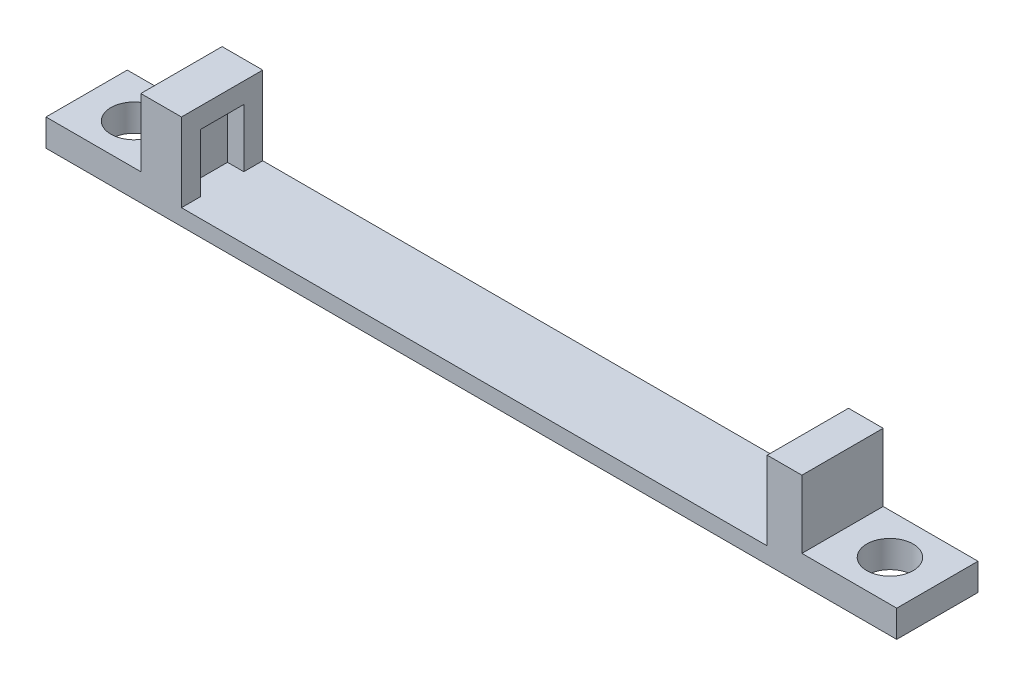
ISO-10303-21;
HEADER;
FILE_DESCRIPTION(('STEP AP214'),'2;1');
FILE_NAME('part.step','',(''),(''),'','','');
FILE_SCHEMA(('AUTOMOTIVE_DESIGN { 1 0 10303 214 1 1 1 1 }'));
ENDSEC;
DATA;
#1=APPLICATION_CONTEXT('core data for automotive mechanical design processes');
#2=APPLICATION_PROTOCOL_DEFINITION('international standard','automotive_design',2000,#1);
#3=PRODUCT_CONTEXT('',#1,'mechanical');
#4=PRODUCT('Part','Part','',(#3));
#5=PRODUCT_RELATED_PRODUCT_CATEGORY('part','',(#4));
#6=PRODUCT_DEFINITION_FORMATION('','',#4);
#7=PRODUCT_DEFINITION_CONTEXT('part definition',#1,'design');
#8=PRODUCT_DEFINITION('design','',#6,#7);
#9=PRODUCT_DEFINITION_SHAPE('','',#8);
#10=(LENGTH_UNIT() NAMED_UNIT(*) SI_UNIT(.MILLI.,.METRE.));
#11=(NAMED_UNIT(*) PLANE_ANGLE_UNIT() SI_UNIT($,.RADIAN.));
#12=(NAMED_UNIT(*) SI_UNIT($,.STERADIAN.) SOLID_ANGLE_UNIT());
#13=UNCERTAINTY_MEASURE_WITH_UNIT(LENGTH_MEASURE(1.E-05),#10,'distance_accuracy_value','');
#14=(GEOMETRIC_REPRESENTATION_CONTEXT(3) GLOBAL_UNCERTAINTY_ASSIGNED_CONTEXT((#13)) GLOBAL_UNIT_ASSIGNED_CONTEXT((#10,
#11,#12)) REPRESENTATION_CONTEXT('',''));
#15=CARTESIAN_POINT('',(0.,0.,0.));
#16=DIRECTION('',(0.,0.,1.));
#17=DIRECTION('',(1.,0.,0.));
#18=AXIS2_PLACEMENT_3D('',#15,#16,#17);
#19=CARTESIAN_POINT('',(53.6739636473072,1.524,5.87264658762612));
#20=DIRECTION('',(1.,0.,0.));
#21=DIRECTION('',(0.,0.,-1.));
#22=AXIS2_PLACEMENT_3D('',#19,#20,#21);
#23=PLANE('',#22);
#24=DIRECTION('',(0.,0.,-1.));
#25=VECTOR('',#24,1.);
#26=CARTESIAN_POINT('',(53.6739636473072,8.89,5.87264658762612));
#27=LINE('',#26,#25);
#28=CARTESIAN_POINT('',(53.6739636473072,8.89,13.4926465876261));
#29=VERTEX_POINT('',#28);
#30=CARTESIAN_POINT('',(53.6739636473072,8.89,5.87264658762612));
#31=VERTEX_POINT('',#30);
#32=EDGE_CURVE('E240',#29,#31,#27,.T.);
#33=ORIENTED_EDGE('',*,*,#32,.T.);
#34=DIRECTION('',(0.,1.,0.));
#35=VECTOR('',#34,1.);
#36=CARTESIAN_POINT('',(53.6739636473072,1.524,5.87264658762612));
#37=LINE('',#36,#35);
#38=CARTESIAN_POINT('',(53.6739636473072,1.524,5.87264658762612));
#39=VERTEX_POINT('',#38);
#40=EDGE_CURVE('E245',#39,#31,#37,.T.);
#41=ORIENTED_EDGE('',*,*,#40,.F.);
#42=DIRECTION('',(0.,0.,-1.));
#43=VECTOR('',#42,1.);
#44=CARTESIAN_POINT('',(53.6739636473072,1.524,5.87264658762612));
#45=LINE('',#44,#43);
#46=CARTESIAN_POINT('',(53.6739636473072,1.524,13.4926465876261));
#47=VERTEX_POINT('',#46);
#48=EDGE_CURVE('E232',#47,#39,#45,.T.);
#49=ORIENTED_EDGE('',*,*,#48,.F.);
#50=DIRECTION('',(0.,1.,0.));
#51=VECTOR('',#50,1.);
#52=CARTESIAN_POINT('',(53.6739636473072,1.524,13.4926465876261));
#53=LINE('',#52,#51);
#54=EDGE_CURVE('E248',#47,#29,#53,.T.);
#55=ORIENTED_EDGE('',*,*,#54,.T.);
#56=EDGE_LOOP('',(#33,#41,#49,#55));
#57=FACE_BOUND('',#56,.T.);
#58=DIRECTION('',(0.,-1.,0.));
#59=VECTOR('',#58,1.);
#60=CARTESIAN_POINT('',(53.6739636473072,6.985,7.84114658762612));
#61=LINE('',#60,#59);
#62=CARTESIAN_POINT('',(53.6739636473072,6.985,7.84114658762612));
#63=VERTEX_POINT('',#62);
#64=CARTESIAN_POINT('',(53.6739636473072,2.54,7.84114658762612));
#65=VERTEX_POINT('',#64);
#66=EDGE_CURVE('E189',#63,#65,#61,.T.);
#67=ORIENTED_EDGE('',*,*,#66,.F.);
#68=DIRECTION('',(0.,0.,-1.));
#69=VECTOR('',#68,1.);
#70=CARTESIAN_POINT('',(53.6739636473072,6.985,7.84114658762612));
#71=LINE('',#70,#69);
#72=CARTESIAN_POINT('',(53.6739636473072,6.985,11.5241465876261));
#73=VERTEX_POINT('',#72);
#74=EDGE_CURVE('E186',#73,#63,#71,.T.);
#75=ORIENTED_EDGE('',*,*,#74,.F.);
#76=DIRECTION('',(0.,1.,0.));
#77=VECTOR('',#76,1.);
#78=CARTESIAN_POINT('',(53.6739636473072,6.985,11.5241465876261));
#79=LINE('',#78,#77);
#80=CARTESIAN_POINT('',(53.6739636473072,2.54,11.5241465876261));
#81=VERTEX_POINT('',#80);
#82=EDGE_CURVE('E53',#81,#73,#79,.T.);
#83=ORIENTED_EDGE('',*,*,#82,.F.);
#84=DIRECTION('',(0.,0.,1.));
#85=VECTOR('',#84,1.);
#86=CARTESIAN_POINT('',(53.6739636473072,2.54,7.84114658762612));
#87=LINE('',#86,#85);
#88=EDGE_CURVE('E48',#65,#81,#87,.T.);
#89=ORIENTED_EDGE('',*,*,#88,.F.);
#90=EDGE_LOOP('',(#67,#75,#83,#89));
#91=FACE_BOUND('',#90,.T.);
#92=ADVANCED_FACE('F33',(#57,#91),#23,.F.);
#93=CARTESIAN_POINT('',(0.,8.89,0.));
#94=DIRECTION('',(0.,1.,0.));
#95=DIRECTION('',(0.,0.,1.));
#96=AXIS2_PLACEMENT_3D('',#93,#94,#95);
#97=PLANE('',#96);
#98=DIRECTION('',(0.,0.,1.));
#99=VECTOR('',#98,1.);
#100=CARTESIAN_POINT('',(-1.24083635269281,8.89,5.87264658762612));
#101=LINE('',#100,#99);
#102=CARTESIAN_POINT('',(-1.24083635269281,8.89,5.87264658762612));
#103=VERTEX_POINT('',#102);
#104=CARTESIAN_POINT('',(-1.2408363526928,8.89,13.4926465876261));
#105=VERTEX_POINT('',#104);
#106=EDGE_CURVE('E218',#103,#105,#101,.T.);
#107=ORIENTED_EDGE('',*,*,#106,.F.);
#108=DIRECTION('',(-1.,0.,0.));
#109=VECTOR('',#108,1.);
#110=CARTESIAN_POINT('',(-13.9408363526928,8.89,5.87264658762612));
#111=LINE('',#110,#109);
#112=CARTESIAN_POINT('',(-5.05083635269281,8.89,5.87264658762612));
#113=VERTEX_POINT('',#112);
#114=EDGE_CURVE('E291',#103,#113,#111,.T.);
#115=ORIENTED_EDGE('',*,*,#114,.T.);
#116=DIRECTION('',(0.,0.,-1.));
#117=VECTOR('',#116,1.);
#118=CARTESIAN_POINT('',(-5.05083635269281,8.89,5.87264658762612));
#119=LINE('',#118,#117);
#120=CARTESIAN_POINT('',(-5.05083635269281,8.89,13.4926465876261));
#121=VERTEX_POINT('',#120);
#122=EDGE_CURVE('E268',#121,#113,#119,.T.);
#123=ORIENTED_EDGE('',*,*,#122,.F.);
#124=DIRECTION('',(1.,0.,0.));
#125=VECTOR('',#124,1.);
#126=CARTESIAN_POINT('',(-13.9408363526928,8.89,13.4926465876261));
#127=LINE('',#126,#125);
#128=EDGE_CURVE('E288',#121,#105,#127,.T.);
#129=ORIENTED_EDGE('',*,*,#128,.T.);
#130=EDGE_LOOP('',(#107,#115,#123,#129));
#131=FACE_BOUND('',#130,.T.);
#132=ADVANCED_FACE('F358',(#131),#97,.T.);
#133=CARTESIAN_POINT('',(-13.9408363526928,8.89,5.87264658762612));
#134=DIRECTION('',(1.,0.,0.));
#135=DIRECTION('',(0.,0.,-1.));
#136=AXIS2_PLACEMENT_3D('',#133,#134,#135);
#137=PLANE('',#136);
#138=DIRECTION('',(0.,0.,1.));
#139=VECTOR('',#138,1.);
#140=CARTESIAN_POINT('',(-13.9408363526928,2.54,5.87264658762612));
#141=LINE('',#140,#139);
#142=CARTESIAN_POINT('',(-13.9408363526928,2.54,5.87264658762612));
#143=VERTEX_POINT('',#142);
#144=CARTESIAN_POINT('',(-13.9408363526928,2.54,13.4926465876261));
#145=VERTEX_POINT('',#144);
#146=EDGE_CURVE('E270',#143,#145,#141,.T.);
#147=ORIENTED_EDGE('',*,*,#146,.F.);
#148=DIRECTION('',(0.,-1.,0.));
#149=VECTOR('',#148,1.);
#150=CARTESIAN_POINT('',(-13.9408363526928,8.89,5.87264658762612));
#151=LINE('',#150,#149);
#152=CARTESIAN_POINT('',(-13.9408363526928,0.,5.87264658762612));
#153=VERTEX_POINT('',#152);
#154=EDGE_CURVE('E296',#143,#153,#151,.T.);
#155=ORIENTED_EDGE('',*,*,#154,.T.);
#156=DIRECTION('',(0.,0.,1.));
#157=VECTOR('',#156,1.);
#158=CARTESIAN_POINT('',(-13.9408363526928,0.,5.87264658762612));
#159=LINE('',#158,#157);
#160=CARTESIAN_POINT('',(-13.9408363526928,0.,13.4926465876261));
#161=VERTEX_POINT('',#160);
#162=EDGE_CURVE('E286',#153,#161,#159,.T.);
#163=ORIENTED_EDGE('',*,*,#162,.T.);
#164=DIRECTION('',(0.,-1.,0.));
#165=VECTOR('',#164,1.);
#166=CARTESIAN_POINT('',(-13.9408363526928,8.89,13.4926465876261));
#167=LINE('',#166,#165);
#168=EDGE_CURVE('E11',#145,#161,#167,.T.);
#169=ORIENTED_EDGE('',*,*,#168,.F.);
#170=EDGE_LOOP('',(#147,#155,#163,#169));
#171=FACE_BOUND('',#170,.T.);
#172=ADVANCED_FACE('F35',(#171),#137,.F.);
#173=CARTESIAN_POINT('',(-13.9408363526928,8.89,13.4926465876261));
#174=DIRECTION('',(0.,0.,-1.));
#175=DIRECTION('',(-1.,0.,0.));
#176=AXIS2_PLACEMENT_3D('',#173,#174,#175);
#177=PLANE('',#176);
#178=DIRECTION('',(1.,0.,0.));
#179=VECTOR('',#178,1.);
#180=CARTESIAN_POINT('',(-1.2408363526928,1.524,13.4926465876261));
#181=LINE('',#180,#179);
#182=CARTESIAN_POINT('',(-1.2408363526928,1.524,13.4926465876261));
#183=VERTEX_POINT('',#182);
#184=EDGE_CURVE('E228',#183,#47,#181,.T.);
#185=ORIENTED_EDGE('',*,*,#184,.F.);
#186=DIRECTION('',(0.,1.,0.));
#187=VECTOR('',#186,1.);
#188=CARTESIAN_POINT('',(-1.2408363526928,1.524,13.4926465876261));
#189=LINE('',#188,#187);
#190=EDGE_CURVE('E238',#183,#105,#189,.T.);
#191=ORIENTED_EDGE('',*,*,#190,.T.);
#192=ORIENTED_EDGE('',*,*,#128,.F.);
#193=DIRECTION('',(0.,1.,0.));
#194=VECTOR('',#193,1.);
#195=CARTESIAN_POINT('',(-5.05083635269281,2.54,13.4926465876261));
#196=LINE('',#195,#194);
#197=CARTESIAN_POINT('',(-5.05083635269281,2.54,13.4926465876261));
#198=VERTEX_POINT('',#197);
#199=EDGE_CURVE('E280',#198,#121,#196,.T.);
#200=ORIENTED_EDGE('',*,*,#199,.F.);
#201=DIRECTION('',(1.,0.,0.));
#202=VECTOR('',#201,1.);
#203=CARTESIAN_POINT('',(-13.9408363526928,2.54,13.4926465876261));
#204=LINE('',#203,#202);
#205=EDGE_CURVE('E272',#145,#198,#204,.T.);
#206=ORIENTED_EDGE('',*,*,#205,.F.);
#207=ORIENTED_EDGE('',*,*,#168,.T.);
#208=DIRECTION('',(1.,0.,0.));
#209=VECTOR('',#208,1.);
#210=CARTESIAN_POINT('',(-13.9408363526928,0.,13.4926465876261));
#211=LINE('',#210,#209);
#212=CARTESIAN_POINT('',(65.8151636473072,0.,13.4926465876261));
#213=VERTEX_POINT('',#212);
#214=EDGE_CURVE('E299',#161,#213,#211,.T.);
#215=ORIENTED_EDGE('',*,*,#214,.T.);
#216=DIRECTION('',(0.,-1.,0.));
#217=VECTOR('',#216,1.);
#218=CARTESIAN_POINT('',(65.8151636473072,8.89,13.4926465876261));
#219=LINE('',#218,#217);
#220=CARTESIAN_POINT('',(65.8151636473072,2.54,13.4926465876261));
#221=VERTEX_POINT('',#220);
#222=EDGE_CURVE('E41',#221,#213,#219,.T.);
#223=ORIENTED_EDGE('',*,*,#222,.F.);
#224=DIRECTION('',(1.,0.,0.));
#225=VECTOR('',#224,1.);
#226=CARTESIAN_POINT('',(65.8151636473072,2.54,13.4926465876261));
#227=LINE('',#226,#225);
#228=CARTESIAN_POINT('',(56.9251636473072,2.54,13.4926465876261));
#229=VERTEX_POINT('',#228);
#230=EDGE_CURVE('E260',#229,#221,#227,.T.);
#231=ORIENTED_EDGE('',*,*,#230,.F.);
#232=DIRECTION('',(0.,1.,0.));
#233=VECTOR('',#232,1.);
#234=CARTESIAN_POINT('',(56.9251636473072,2.54,13.4926465876261));
#235=LINE('',#234,#233);
#236=CARTESIAN_POINT('',(56.9251636473072,8.89,13.4926465876261));
#237=VERTEX_POINT('',#236);
#238=EDGE_CURVE('E265',#229,#237,#235,.T.);
#239=ORIENTED_EDGE('',*,*,#238,.T.);
#240=EDGE_CURVE('E292',#29,#237,#127,.T.);
#241=ORIENTED_EDGE('',*,*,#240,.F.);
#242=ORIENTED_EDGE('',*,*,#54,.F.);
#243=EDGE_LOOP('',(#185,#191,#192,#200,#206,#207,#215,#223,#231,#239,#241,#242));
#244=FACE_BOUND('',#243,.T.);
#245=ADVANCED_FACE('F321',(#244),#177,.F.);
#246=CARTESIAN_POINT('',(65.8151636473072,8.89,5.87264658762612));
#247=DIRECTION('',(-1.,0.,0.));
#248=DIRECTION('',(0.,0.,1.));
#249=AXIS2_PLACEMENT_3D('',#246,#247,#248);
#250=PLANE('',#249);
#251=DIRECTION('',(0.,-1.,0.));
#252=VECTOR('',#251,1.);
#253=CARTESIAN_POINT('',(65.8151636473072,8.89,5.87264658762612));
#254=LINE('',#253,#252);
#255=CARTESIAN_POINT('',(65.8151636473072,2.54,5.87264658762612));
#256=VERTEX_POINT('',#255);
#257=CARTESIAN_POINT('',(65.8151636473072,0.,5.87264658762612));
#258=VERTEX_POINT('',#257);
#259=EDGE_CURVE('E309',#256,#258,#254,.T.);
#260=ORIENTED_EDGE('',*,*,#259,.F.);
#261=DIRECTION('',(0.,0.,-1.));
#262=VECTOR('',#261,1.);
#263=CARTESIAN_POINT('',(65.8151636473072,2.54,5.87264658762612));
#264=LINE('',#263,#262);
#265=EDGE_CURVE('E252',#221,#256,#264,.T.);
#266=ORIENTED_EDGE('',*,*,#265,.F.);
#267=ORIENTED_EDGE('',*,*,#222,.T.);
#268=DIRECTION('',(0.,0.,-1.));
#269=VECTOR('',#268,1.);
#270=CARTESIAN_POINT('',(65.8151636473072,0.,5.87264658762612));
#271=LINE('',#270,#269);
#272=EDGE_CURVE('E302',#213,#258,#271,.T.);
#273=ORIENTED_EDGE('',*,*,#272,.T.);
#274=EDGE_LOOP('',(#260,#266,#267,#273));
#275=FACE_BOUND('',#274,.T.);
#276=ADVANCED_FACE('F314',(#275),#250,.F.);
#277=CARTESIAN_POINT('',(-13.9408363526928,8.89,5.87264658762612));
#278=DIRECTION('',(0.,0.,1.));
#279=DIRECTION('',(1.,0.,0.));
#280=AXIS2_PLACEMENT_3D('',#277,#278,#279);
#281=PLANE('',#280);
#282=ORIENTED_EDGE('',*,*,#114,.F.);
#283=DIRECTION('',(0.,1.,0.));
#284=VECTOR('',#283,1.);
#285=CARTESIAN_POINT('',(-1.24083635269281,1.524,5.87264658762612));
#286=LINE('',#285,#284);
#287=CARTESIAN_POINT('',(-1.24083635269281,1.524,5.87264658762612));
#288=VERTEX_POINT('',#287);
#289=EDGE_CURVE('E242',#288,#103,#286,.T.);
#290=ORIENTED_EDGE('',*,*,#289,.F.);
#291=DIRECTION('',(-1.,0.,0.));
#292=VECTOR('',#291,1.);
#293=CARTESIAN_POINT('',(-1.24083635269281,1.524,5.87264658762612));
#294=LINE('',#293,#292);
#295=EDGE_CURVE('E235',#39,#288,#294,.T.);
#296=ORIENTED_EDGE('',*,*,#295,.F.);
#297=ORIENTED_EDGE('',*,*,#40,.T.);
#298=CARTESIAN_POINT('',(56.9251636473072,8.89,5.87264658762612));
#299=VERTEX_POINT('',#298);
#300=EDGE_CURVE('E293',#299,#31,#111,.T.);
#301=ORIENTED_EDGE('',*,*,#300,.F.);
#302=DIRECTION('',(0.,1.,0.));
#303=VECTOR('',#302,1.);
#304=CARTESIAN_POINT('',(56.9251636473072,2.54,5.87264658762612));
#305=LINE('',#304,#303);
#306=CARTESIAN_POINT('',(56.9251636473072,2.54,5.87264658762612));
#307=VERTEX_POINT('',#306);
#308=EDGE_CURVE('E262',#307,#299,#305,.T.);
#309=ORIENTED_EDGE('',*,*,#308,.F.);
#310=DIRECTION('',(-1.,0.,0.));
#311=VECTOR('',#310,1.);
#312=CARTESIAN_POINT('',(65.8151636473072,2.54,5.87264658762612));
#313=LINE('',#312,#311);
#314=EDGE_CURVE('E254',#256,#307,#313,.T.);
#315=ORIENTED_EDGE('',*,*,#314,.F.);
#316=ORIENTED_EDGE('',*,*,#259,.T.);
#317=DIRECTION('',(-1.,0.,0.));
#318=VECTOR('',#317,1.);
#319=CARTESIAN_POINT('',(-13.9408363526928,0.,5.87264658762612));
#320=LINE('',#319,#318);
#321=EDGE_CURVE('E305',#258,#153,#320,.T.);
#322=ORIENTED_EDGE('',*,*,#321,.T.);
#323=ORIENTED_EDGE('',*,*,#154,.F.);
#324=DIRECTION('',(-1.,0.,0.));
#325=VECTOR('',#324,1.);
#326=CARTESIAN_POINT('',(-13.9408363526928,2.54,5.87264658762612));
#327=LINE('',#326,#325);
#328=CARTESIAN_POINT('',(-5.05083635269281,2.54,5.87264658762612));
#329=VERTEX_POINT('',#328);
#330=EDGE_CURVE('E278',#329,#143,#327,.T.);
#331=ORIENTED_EDGE('',*,*,#330,.F.);
#332=DIRECTION('',(0.,1.,0.));
#333=VECTOR('',#332,1.);
#334=CARTESIAN_POINT('',(-5.05083635269281,2.54,5.87264658762612));
#335=LINE('',#334,#333);
#336=EDGE_CURVE('E283',#329,#113,#335,.T.);
#337=ORIENTED_EDGE('',*,*,#336,.T.);
#338=EDGE_LOOP('',(#282,#290,#296,#297,#301,#309,#315,#316,#322,#323,#331,#337));
#339=FACE_BOUND('',#338,.T.);
#340=ADVANCED_FACE('F330',(#339),#281,.F.);
#341=ORIENTED_EDGE('',*,*,#32,.F.);
#342=ORIENTED_EDGE('',*,*,#240,.T.);
#343=DIRECTION('',(0.,0.,1.));
#344=VECTOR('',#343,1.);
#345=CARTESIAN_POINT('',(56.9251636473072,8.89,5.87264658762612));
#346=LINE('',#345,#344);
#347=EDGE_CURVE('E244',#299,#237,#346,.T.);
#348=ORIENTED_EDGE('',*,*,#347,.F.);
#349=ORIENTED_EDGE('',*,*,#300,.T.);
#350=EDGE_LOOP('',(#341,#342,#348,#349));
#351=FACE_BOUND('',#350,.T.);
#352=ADVANCED_FACE('F344',(#351),#97,.T.);
#353=CARTESIAN_POINT('',(0.,0.,0.));
#354=DIRECTION('',(0.,1.,0.));
#355=DIRECTION('',(0.,0.,1.));
#356=AXIS2_PLACEMENT_3D('',#353,#354,#355);
#357=PLANE('',#356);
#358=CARTESIAN_POINT('',(61.3701636473072,0.,9.68264658762611));
#359=DIRECTION('',(0.,1.,0.));
#360=DIRECTION('',(0.,0.,1.));
#361=AXIS2_PLACEMENT_3D('',#358,#359,#360);
#362=CIRCLE('',#361,2.17169999999999);
#363=CARTESIAN_POINT('',(61.3701636473072,0.,11.8543465876261));
#364=VERTEX_POINT('',#363);
#365=EDGE_CURVE('E588',#364,#364,#362,.T.);
#366=ORIENTED_EDGE('',*,*,#365,.T.);
#367=EDGE_LOOP('',(#366));
#368=FACE_BOUND('',#367,.T.);
#369=CARTESIAN_POINT('',(-9.49583635269281,0.,9.68264658762611));
#370=DIRECTION('',(0.,1.,0.));
#371=DIRECTION('',(0.,0.,1.));
#372=AXIS2_PLACEMENT_3D('',#369,#370,#371);
#373=CIRCLE('',#372,2.1717);
#374=CARTESIAN_POINT('',(-9.49583635269281,0.,11.8543465876261));
#375=VERTEX_POINT('',#374);
#376=EDGE_CURVE('E596',#375,#375,#373,.T.);
#377=ORIENTED_EDGE('',*,*,#376,.T.);
#378=EDGE_LOOP('',(#377));
#379=FACE_BOUND('',#378,.T.);
#380=ORIENTED_EDGE('',*,*,#162,.F.);
#381=ORIENTED_EDGE('',*,*,#321,.F.);
#382=ORIENTED_EDGE('',*,*,#272,.F.);
#383=ORIENTED_EDGE('',*,*,#214,.F.);
#384=EDGE_LOOP('',(#380,#381,#382,#383));
#385=FACE_BOUND('',#384,.T.);
#386=ADVANCED_FACE('F326',(#368,#379,#385),#357,.F.);
#387=CARTESIAN_POINT('',(-5.05083635269281,2.54,5.87264658762612));
#388=DIRECTION('',(1.,0.,0.));
#389=DIRECTION('',(0.,0.,-1.));
#390=AXIS2_PLACEMENT_3D('',#387,#388,#389);
#391=PLANE('',#390);
#392=ORIENTED_EDGE('',*,*,#122,.T.);
#393=ORIENTED_EDGE('',*,*,#336,.F.);
#394=DIRECTION('',(0.,0.,-1.));
#395=VECTOR('',#394,1.);
#396=CARTESIAN_POINT('',(-5.05083635269281,2.54,5.87264658762612));
#397=LINE('',#396,#395);
#398=EDGE_CURVE('E275',#198,#329,#397,.T.);
#399=ORIENTED_EDGE('',*,*,#398,.F.);
#400=ORIENTED_EDGE('',*,*,#199,.T.);
#401=EDGE_LOOP('',(#392,#393,#399,#400));
#402=FACE_BOUND('',#401,.T.);
#403=ADVANCED_FACE('F360',(#402),#391,.F.);
#404=CARTESIAN_POINT('',(0.,2.54,0.));
#405=DIRECTION('',(0.,1.,0.));
#406=DIRECTION('',(0.,0.,1.));
#407=AXIS2_PLACEMENT_3D('',#404,#405,#406);
#408=PLANE('',#407);
#409=CARTESIAN_POINT('',(-9.49583635269281,2.54,9.68264658762611));
#410=DIRECTION('',(0.,1.,0.));
#411=DIRECTION('',(0.,0.,1.));
#412=AXIS2_PLACEMENT_3D('',#409,#410,#411);
#413=CIRCLE('',#412,2.1717);
#414=CARTESIAN_POINT('',(-9.49583635269281,2.54,11.8543465876261));
#415=VERTEX_POINT('',#414);
#416=EDGE_CURVE('E593',#415,#415,#413,.T.);
#417=ORIENTED_EDGE('',*,*,#416,.F.);
#418=EDGE_LOOP('',(#417));
#419=FACE_BOUND('',#418,.T.);
#420=ORIENTED_EDGE('',*,*,#146,.T.);
#421=ORIENTED_EDGE('',*,*,#205,.T.);
#422=ORIENTED_EDGE('',*,*,#398,.T.);
#423=ORIENTED_EDGE('',*,*,#330,.T.);
#424=EDGE_LOOP('',(#420,#421,#422,#423));
#425=FACE_BOUND('',#424,.T.);
#426=ADVANCED_FACE('F363',(#419,#425),#408,.T.);
#427=CARTESIAN_POINT('',(56.9251636473072,2.54,5.87264658762612));
#428=DIRECTION('',(-1.,0.,0.));
#429=DIRECTION('',(0.,0.,1.));
#430=AXIS2_PLACEMENT_3D('',#427,#428,#429);
#431=PLANE('',#430);
#432=ORIENTED_EDGE('',*,*,#347,.T.);
#433=ORIENTED_EDGE('',*,*,#238,.F.);
#434=DIRECTION('',(0.,0.,1.));
#435=VECTOR('',#434,1.);
#436=CARTESIAN_POINT('',(56.9251636473072,2.54,5.87264658762612));
#437=LINE('',#436,#435);
#438=EDGE_CURVE('E257',#307,#229,#437,.T.);
#439=ORIENTED_EDGE('',*,*,#438,.F.);
#440=ORIENTED_EDGE('',*,*,#308,.T.);
#441=EDGE_LOOP('',(#432,#433,#439,#440));
#442=FACE_BOUND('',#441,.T.);
#443=ADVANCED_FACE('F340',(#442),#431,.F.);
#444=CARTESIAN_POINT('',(0.,2.54,0.));
#445=DIRECTION('',(0.,-1.,0.));
#446=DIRECTION('',(0.,0.,-1.));
#447=AXIS2_PLACEMENT_3D('',#444,#445,#446);
#448=PLANE('',#447);
#449=CARTESIAN_POINT('',(61.3701636473072,2.54,9.68264658762611));
#450=DIRECTION('',(0.,1.,0.));
#451=DIRECTION('',(0.,0.,1.));
#452=AXIS2_PLACEMENT_3D('',#449,#450,#451);
#453=CIRCLE('',#452,2.17169999999999);
#454=CARTESIAN_POINT('',(61.3701636473072,2.54,11.8543465876261));
#455=VERTEX_POINT('',#454);
#456=EDGE_CURVE('E591',#455,#455,#453,.T.);
#457=ORIENTED_EDGE('',*,*,#456,.F.);
#458=EDGE_LOOP('',(#457));
#459=FACE_BOUND('',#458,.T.);
#460=ORIENTED_EDGE('',*,*,#265,.T.);
#461=ORIENTED_EDGE('',*,*,#314,.T.);
#462=ORIENTED_EDGE('',*,*,#438,.T.);
#463=ORIENTED_EDGE('',*,*,#230,.T.);
#464=EDGE_LOOP('',(#460,#461,#462,#463));
#465=FACE_BOUND('',#464,.T.);
#466=ADVANCED_FACE('F336',(#459,#465),#448,.F.);
#467=CARTESIAN_POINT('',(-1.24083635269281,1.524,5.87264658762612));
#468=DIRECTION('',(-1.,0.,0.));
#469=DIRECTION('',(0.,0.,1.));
#470=AXIS2_PLACEMENT_3D('',#467,#468,#469);
#471=PLANE('',#470);
#472=DIRECTION('',(0.,0.,1.));
#473=VECTOR('',#472,1.);
#474=CARTESIAN_POINT('',(-1.24083635269281,1.524,5.87264658762612));
#475=LINE('',#474,#473);
#476=CARTESIAN_POINT('',(-1.24083635269281,1.524,11.7146465876261));
#477=VERTEX_POINT('',#476);
#478=EDGE_CURVE('E229',#477,#183,#475,.T.);
#479=ORIENTED_EDGE('',*,*,#478,.F.);
#480=DIRECTION('',(0.,-1.,0.));
#481=VECTOR('',#480,1.);
#482=CARTESIAN_POINT('',(-1.24083635269281,6.985,11.7146465876261));
#483=LINE('',#482,#481);
#484=CARTESIAN_POINT('',(-1.24083635269281,6.985,11.7146465876261));
#485=VERTEX_POINT('',#484);
#486=EDGE_CURVE('E190',#485,#477,#483,.T.);
#487=ORIENTED_EDGE('',*,*,#486,.F.);
#488=DIRECTION('',(0.,0.,1.));
#489=VECTOR('',#488,1.);
#490=CARTESIAN_POINT('',(-1.24083635269281,6.985,11.7146465876261));
#491=LINE('',#490,#489);
#492=CARTESIAN_POINT('',(-1.24083635269281,6.985,7.65064658762611));
#493=VERTEX_POINT('',#492);
#494=EDGE_CURVE('E202',#493,#485,#491,.T.);
#495=ORIENTED_EDGE('',*,*,#494,.F.);
#496=DIRECTION('',(0.,1.,0.));
#497=VECTOR('',#496,1.);
#498=CARTESIAN_POINT('',(-1.24083635269281,6.985,7.65064658762611));
#499=LINE('',#498,#497);
#500=CARTESIAN_POINT('',(-1.24083635269281,1.524,7.65064658762611));
#501=VERTEX_POINT('',#500);
#502=EDGE_CURVE('E192',#501,#493,#499,.T.);
#503=ORIENTED_EDGE('',*,*,#502,.F.);
#504=EDGE_CURVE('E225',#288,#501,#475,.T.);
#505=ORIENTED_EDGE('',*,*,#504,.F.);
#506=ORIENTED_EDGE('',*,*,#289,.T.);
#507=ORIENTED_EDGE('',*,*,#106,.T.);
#508=ORIENTED_EDGE('',*,*,#190,.F.);
#509=EDGE_LOOP('',(#479,#487,#495,#503,#505,#506,#507,#508));
#510=FACE_BOUND('',#509,.T.);
#511=ADVANCED_FACE('F378',(#510),#471,.F.);
#512=CARTESIAN_POINT('',(0.,1.524,0.));
#513=DIRECTION('',(0.,1.,0.));
#514=DIRECTION('',(0.,0.,1.));
#515=AXIS2_PLACEMENT_3D('',#512,#513,#514);
#516=PLANE('',#515);
#517=ORIENTED_EDGE('',*,*,#504,.T.);
#518=DIRECTION('',(1.,0.,0.));
#519=VECTOR('',#518,1.);
#520=CARTESIAN_POINT('',(-2.76483635269281,1.524,7.65064658762611));
#521=LINE('',#520,#519);
#522=CARTESIAN_POINT('',(-2.76483635269281,1.524,7.65064658762611));
#523=VERTEX_POINT('',#522);
#524=EDGE_CURVE('E221',#523,#501,#521,.T.);
#525=ORIENTED_EDGE('',*,*,#524,.F.);
#526=DIRECTION('',(0.,0.,-1.));
#527=VECTOR('',#526,1.);
#528=CARTESIAN_POINT('',(-2.76483635269281,1.524,11.7146465876261));
#529=LINE('',#528,#527);
#530=CARTESIAN_POINT('',(-2.76483635269281,1.524,11.7146465876261));
#531=VERTEX_POINT('',#530);
#532=EDGE_CURVE('E201',#531,#523,#529,.T.);
#533=ORIENTED_EDGE('',*,*,#532,.F.);
#534=DIRECTION('',(1.,0.,0.));
#535=VECTOR('',#534,1.);
#536=CARTESIAN_POINT('',(-2.76483635269281,1.524,11.7146465876261));
#537=LINE('',#536,#535);
#538=EDGE_CURVE('E210',#531,#477,#537,.T.);
#539=ORIENTED_EDGE('',*,*,#538,.T.);
#540=ORIENTED_EDGE('',*,*,#478,.T.);
#541=ORIENTED_EDGE('',*,*,#184,.T.);
#542=ORIENTED_EDGE('',*,*,#48,.T.);
#543=ORIENTED_EDGE('',*,*,#295,.T.);
#544=EDGE_LOOP('',(#517,#525,#533,#539,#540,#541,#542,#543));
#545=FACE_BOUND('',#544,.T.);
#546=ADVANCED_FACE('F349',(#545),#516,.T.);
#547=CARTESIAN_POINT('',(-2.76483635269281,6.985,11.7146465876261));
#548=DIRECTION('',(0.,0.,1.));
#549=DIRECTION('',(1.,0.,0.));
#550=AXIS2_PLACEMENT_3D('',#547,#548,#549);
#551=PLANE('',#550);
#552=ORIENTED_EDGE('',*,*,#486,.T.);
#553=ORIENTED_EDGE('',*,*,#538,.F.);
#554=DIRECTION('',(0.,-1.,0.));
#555=VECTOR('',#554,1.);
#556=CARTESIAN_POINT('',(-2.76483635269281,6.985,11.7146465876261));
#557=LINE('',#556,#555);
#558=CARTESIAN_POINT('',(-2.76483635269281,6.985,11.7146465876261));
#559=VERTEX_POINT('',#558);
#560=EDGE_CURVE('E198',#559,#531,#557,.T.);
#561=ORIENTED_EDGE('',*,*,#560,.F.);
#562=DIRECTION('',(1.,0.,0.));
#563=VECTOR('',#562,1.);
#564=CARTESIAN_POINT('',(-2.76483635269281,6.985,11.7146465876261));
#565=LINE('',#564,#563);
#566=EDGE_CURVE('E216',#559,#485,#565,.T.);
#567=ORIENTED_EDGE('',*,*,#566,.T.);
#568=EDGE_LOOP('',(#552,#553,#561,#567));
#569=FACE_BOUND('',#568,.T.);
#570=ADVANCED_FACE('F444',(#569),#551,.F.);
#571=CARTESIAN_POINT('',(-2.76483635269281,6.985,11.7146465876261));
#572=DIRECTION('',(0.,1.,0.));
#573=DIRECTION('',(0.,0.,1.));
#574=AXIS2_PLACEMENT_3D('',#571,#572,#573);
#575=PLANE('',#574);
#576=ORIENTED_EDGE('',*,*,#494,.T.);
#577=ORIENTED_EDGE('',*,*,#566,.F.);
#578=DIRECTION('',(0.,0.,1.));
#579=VECTOR('',#578,1.);
#580=CARTESIAN_POINT('',(-2.76483635269281,6.985,11.7146465876261));
#581=LINE('',#580,#579);
#582=CARTESIAN_POINT('',(-2.76483635269281,6.985,7.65064658762611));
#583=VERTEX_POINT('',#582);
#584=EDGE_CURVE('E208',#583,#559,#581,.T.);
#585=ORIENTED_EDGE('',*,*,#584,.F.);
#586=DIRECTION('',(1.,0.,0.));
#587=VECTOR('',#586,1.);
#588=CARTESIAN_POINT('',(-2.76483635269281,6.985,7.65064658762611));
#589=LINE('',#588,#587);
#590=EDGE_CURVE('E219',#583,#493,#589,.T.);
#591=ORIENTED_EDGE('',*,*,#590,.T.);
#592=EDGE_LOOP('',(#576,#577,#585,#591));
#593=FACE_BOUND('',#592,.T.);
#594=ADVANCED_FACE('F450',(#593),#575,.F.);
#595=CARTESIAN_POINT('',(-2.76483635269281,6.985,7.65064658762611));
#596=DIRECTION('',(0.,0.,-1.));
#597=DIRECTION('',(-1.,0.,0.));
#598=AXIS2_PLACEMENT_3D('',#595,#596,#597);
#599=PLANE('',#598);
#600=ORIENTED_EDGE('',*,*,#502,.T.);
#601=ORIENTED_EDGE('',*,*,#590,.F.);
#602=DIRECTION('',(0.,1.,0.));
#603=VECTOR('',#602,1.);
#604=CARTESIAN_POINT('',(-2.76483635269281,6.985,7.65064658762611));
#605=LINE('',#604,#603);
#606=EDGE_CURVE('E205',#523,#583,#605,.T.);
#607=ORIENTED_EDGE('',*,*,#606,.F.);
#608=ORIENTED_EDGE('',*,*,#524,.T.);
#609=EDGE_LOOP('',(#600,#601,#607,#608));
#610=FACE_BOUND('',#609,.T.);
#611=ADVANCED_FACE('F457',(#610),#599,.F.);
#612=CARTESIAN_POINT('',(-2.76483635269281,0.,0.));
#613=DIRECTION('',(1.,0.,0.));
#614=DIRECTION('',(0.,0.,-1.));
#615=AXIS2_PLACEMENT_3D('',#612,#613,#614);
#616=PLANE('',#615);
#617=ORIENTED_EDGE('',*,*,#560,.T.);
#618=ORIENTED_EDGE('',*,*,#532,.T.);
#619=ORIENTED_EDGE('',*,*,#606,.T.);
#620=ORIENTED_EDGE('',*,*,#584,.T.);
#621=EDGE_LOOP('',(#617,#618,#619,#620));
#622=FACE_BOUND('',#621,.T.);
#623=ADVANCED_FACE('F465',(#622),#616,.T.);
#624=CARTESIAN_POINT('',(52.1499636473072,6.985,7.84114658762612));
#625=DIRECTION('',(0.,0.,1.));
#626=DIRECTION('',(1.,0.,0.));
#627=AXIS2_PLACEMENT_3D('',#624,#625,#626);
#628=PLANE('',#627);
#629=ORIENTED_EDGE('',*,*,#66,.T.);
#630=DIRECTION('',(1.,0.,0.));
#631=VECTOR('',#630,1.);
#632=CARTESIAN_POINT('',(52.1499636473072,2.54,7.84114658762612));
#633=LINE('',#632,#631);
#634=CARTESIAN_POINT('',(52.1499636473072,2.54,7.84114658762612));
#635=VERTEX_POINT('',#634);
#636=EDGE_CURVE('E170',#635,#65,#633,.T.);
#637=ORIENTED_EDGE('',*,*,#636,.F.);
#638=DIRECTION('',(0.,-1.,0.));
#639=VECTOR('',#638,1.);
#640=CARTESIAN_POINT('',(52.1499636473072,6.985,7.84114658762612));
#641=LINE('',#640,#639);
#642=CARTESIAN_POINT('',(52.1499636473072,6.985,7.84114658762612));
#643=VERTEX_POINT('',#642);
#644=EDGE_CURVE('E177',#643,#635,#641,.T.);
#645=ORIENTED_EDGE('',*,*,#644,.F.);
#646=DIRECTION('',(1.,0.,0.));
#647=VECTOR('',#646,1.);
#648=CARTESIAN_POINT('',(52.1499636473072,6.985,7.84114658762612));
#649=LINE('',#648,#647);
#650=EDGE_CURVE('E603',#643,#63,#649,.T.);
#651=ORIENTED_EDGE('',*,*,#650,.T.);
#652=EDGE_LOOP('',(#629,#637,#645,#651));
#653=FACE_BOUND('',#652,.T.);
#654=ADVANCED_FACE('F188',(#653),#628,.F.);
#655=CARTESIAN_POINT('',(52.1499636473072,2.54,7.84114658762612));
#656=DIRECTION('',(0.,1.,0.));
#657=DIRECTION('',(0.,0.,1.));
#658=AXIS2_PLACEMENT_3D('',#655,#656,#657);
#659=PLANE('',#658);
#660=ORIENTED_EDGE('',*,*,#88,.T.);
#661=DIRECTION('',(1.,0.,0.));
#662=VECTOR('',#661,1.);
#663=CARTESIAN_POINT('',(52.1499636473072,2.54,11.5241465876261));
#664=LINE('',#663,#662);
#665=CARTESIAN_POINT('',(52.1499636473072,2.54,11.5241465876261));
#666=VERTEX_POINT('',#665);
#667=EDGE_CURVE('E173',#666,#81,#664,.T.);
#668=ORIENTED_EDGE('',*,*,#667,.F.);
#669=DIRECTION('',(0.,0.,1.));
#670=VECTOR('',#669,1.);
#671=CARTESIAN_POINT('',(52.1499636473072,2.54,7.84114658762612));
#672=LINE('',#671,#670);
#673=EDGE_CURVE('E166',#635,#666,#672,.T.);
#674=ORIENTED_EDGE('',*,*,#673,.F.);
#675=ORIENTED_EDGE('',*,*,#636,.T.);
#676=EDGE_LOOP('',(#660,#668,#674,#675));
#677=FACE_BOUND('',#676,.T.);
#678=ADVANCED_FACE('F168',(#677),#659,.F.);
#679=CARTESIAN_POINT('',(52.1499636473072,6.985,11.5241465876261));
#680=DIRECTION('',(0.,0.,-1.));
#681=DIRECTION('',(0.,1.,0.));
#682=AXIS2_PLACEMENT_3D('',#679,#680,#681);
#683=PLANE('',#682);
#684=ORIENTED_EDGE('',*,*,#82,.T.);
#685=DIRECTION('',(1.,0.,0.));
#686=VECTOR('',#685,1.);
#687=CARTESIAN_POINT('',(52.1499636473072,6.985,11.5241465876261));
#688=LINE('',#687,#686);
#689=CARTESIAN_POINT('',(52.1499636473072,6.985,11.5241465876261));
#690=VERTEX_POINT('',#689);
#691=EDGE_CURVE('E194',#690,#73,#688,.T.);
#692=ORIENTED_EDGE('',*,*,#691,.F.);
#693=DIRECTION('',(0.,1.,0.));
#694=VECTOR('',#693,1.);
#695=CARTESIAN_POINT('',(52.1499636473072,6.985,11.5241465876261));
#696=LINE('',#695,#694);
#697=EDGE_CURVE('E176',#666,#690,#696,.T.);
#698=ORIENTED_EDGE('',*,*,#697,.F.);
#699=ORIENTED_EDGE('',*,*,#667,.T.);
#700=EDGE_LOOP('',(#684,#692,#698,#699));
#701=FACE_BOUND('',#700,.T.);
#702=ADVANCED_FACE('F486',(#701),#683,.F.);
#703=CARTESIAN_POINT('',(52.1499636473072,6.985,7.84114658762612));
#704=DIRECTION('',(0.,-1.,0.));
#705=DIRECTION('',(0.,0.,-1.));
#706=AXIS2_PLACEMENT_3D('',#703,#704,#705);
#707=PLANE('',#706);
#708=ORIENTED_EDGE('',*,*,#74,.T.);
#709=ORIENTED_EDGE('',*,*,#650,.F.);
#710=DIRECTION('',(0.,0.,-1.));
#711=VECTOR('',#710,1.);
#712=CARTESIAN_POINT('',(52.1499636473072,6.985,7.84114658762612));
#713=LINE('',#712,#711);
#714=EDGE_CURVE('E182',#690,#643,#713,.T.);
#715=ORIENTED_EDGE('',*,*,#714,.F.);
#716=ORIENTED_EDGE('',*,*,#691,.T.);
#717=EDGE_LOOP('',(#708,#709,#715,#716));
#718=FACE_BOUND('',#717,.T.);
#719=ADVANCED_FACE('F493',(#718),#707,.F.);
#720=CARTESIAN_POINT('',(52.1499636473072,0.,0.));
#721=DIRECTION('',(-1.,0.,0.));
#722=DIRECTION('',(0.,0.,1.));
#723=AXIS2_PLACEMENT_3D('',#720,#721,#722);
#724=PLANE('',#723);
#725=ORIENTED_EDGE('',*,*,#644,.T.);
#726=ORIENTED_EDGE('',*,*,#673,.T.);
#727=ORIENTED_EDGE('',*,*,#697,.T.);
#728=ORIENTED_EDGE('',*,*,#714,.T.);
#729=EDGE_LOOP('',(#725,#726,#727,#728));
#730=FACE_BOUND('',#729,.T.);
#731=ADVANCED_FACE('F180',(#730),#724,.T.);
#732=CARTESIAN_POINT('',(-9.49583635269281,0.,9.68264658762611));
#733=DIRECTION('',(0.,1.,0.));
#734=DIRECTION('',(0.,0.,1.));
#735=AXIS2_PLACEMENT_3D('',#732,#733,#734);
#736=CYLINDRICAL_SURFACE('',#735,2.1717);
#737=ORIENTED_EDGE('',*,*,#376,.F.);
#738=EDGE_LOOP('',(#737));
#739=FACE_BOUND('',#738,.T.);
#740=ORIENTED_EDGE('',*,*,#416,.T.);
#741=EDGE_LOOP('',(#740));
#742=FACE_BOUND('',#741,.T.);
#743=ADVANCED_FACE('F507',(#739,#742),#736,.F.);
#744=CARTESIAN_POINT('',(61.3701636473072,0.,9.68264658762611));
#745=DIRECTION('',(0.,1.,0.));
#746=DIRECTION('',(0.,0.,1.));
#747=AXIS2_PLACEMENT_3D('',#744,#745,#746);
#748=CYLINDRICAL_SURFACE('',#747,2.17169999999999);
#749=ORIENTED_EDGE('',*,*,#365,.F.);
#750=EDGE_LOOP('',(#749));
#751=FACE_BOUND('',#750,.T.);
#752=ORIENTED_EDGE('',*,*,#456,.T.);
#753=EDGE_LOOP('',(#752));
#754=FACE_BOUND('',#753,.T.);
#755=ADVANCED_FACE('F513',(#751,#754),#748,.F.);
#756=CLOSED_SHELL('',(#92,#132,#172,#245,#276,#340,#352,#386,#403,#426,#443,#466,#511,#546,#570,
#594,#611,#623,#654,#678,#702,#719,#731,#743,#755));
#757=MANIFOLD_SOLID_BREP('B2',#756);
#758=ADVANCED_BREP_SHAPE_REPRESENTATION('',(#18,#757),#14);
#759=SHAPE_DEFINITION_REPRESENTATION(#9,#758);
ENDSEC;
END-ISO-10303-21;
